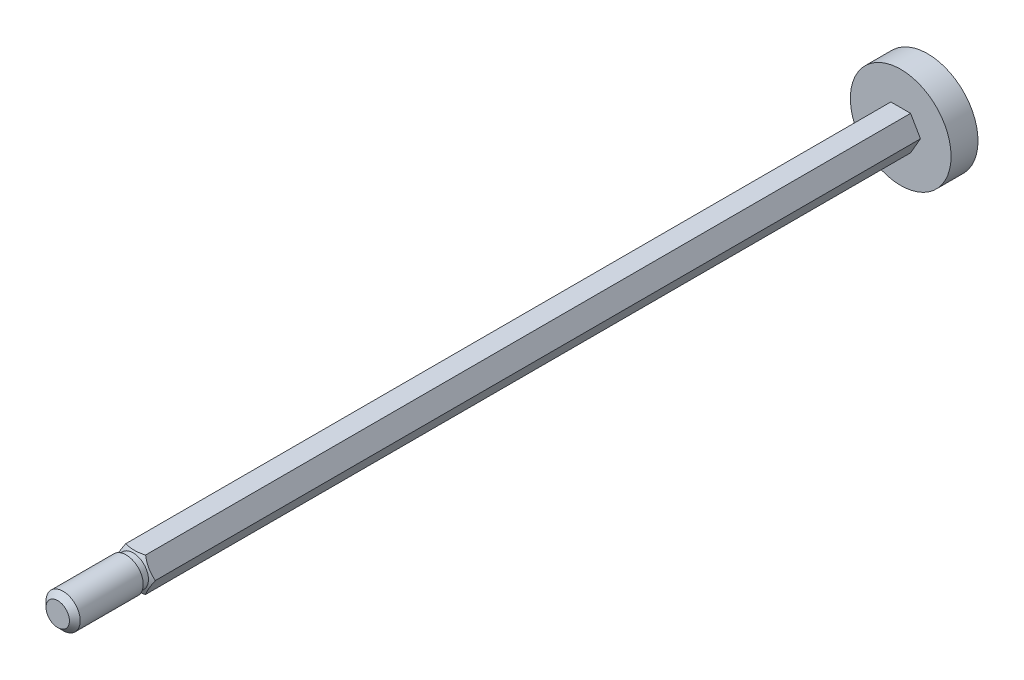
ISO-10303-21;
HEADER;
FILE_DESCRIPTION(('STEP AP214'),'2;1');
FILE_NAME('part.step','',(''),(''),'','','');
FILE_SCHEMA(('AUTOMOTIVE_DESIGN { 1 0 10303 214 1 1 1 1 }'));
ENDSEC;
DATA;
#1=APPLICATION_CONTEXT('core data for automotive mechanical design processes');
#2=APPLICATION_PROTOCOL_DEFINITION('international standard','automotive_design',2000,#1);
#3=PRODUCT_CONTEXT('',#1,'mechanical');
#4=PRODUCT('Part','Part','',(#3));
#5=PRODUCT_RELATED_PRODUCT_CATEGORY('part','',(#4));
#6=PRODUCT_DEFINITION_FORMATION('','',#4);
#7=PRODUCT_DEFINITION_CONTEXT('part definition',#1,'design');
#8=PRODUCT_DEFINITION('design','',#6,#7);
#9=PRODUCT_DEFINITION_SHAPE('','',#8);
#10=(LENGTH_UNIT() NAMED_UNIT(*) SI_UNIT(.MILLI.,.METRE.));
#11=(NAMED_UNIT(*) PLANE_ANGLE_UNIT() SI_UNIT($,.RADIAN.));
#12=(NAMED_UNIT(*) SI_UNIT($,.STERADIAN.) SOLID_ANGLE_UNIT());
#13=UNCERTAINTY_MEASURE_WITH_UNIT(LENGTH_MEASURE(1.E-05),#10,'distance_accuracy_value','');
#14=(GEOMETRIC_REPRESENTATION_CONTEXT(3) GLOBAL_UNCERTAINTY_ASSIGNED_CONTEXT((#13)) GLOBAL_UNIT_ASSIGNED_CONTEXT((#10,
#11,#12)) REPRESENTATION_CONTEXT('',''));
#15=CARTESIAN_POINT('',(0.,0.,0.));
#16=DIRECTION('',(0.,0.,1.));
#17=DIRECTION('',(1.,0.,0.));
#18=AXIS2_PLACEMENT_3D('',#15,#16,#17);
#19=CARTESIAN_POINT('',(0.,0.,47.2885337532627));
#20=DIRECTION('',(0.,0.,-1.));
#21=DIRECTION('',(-1.,0.,0.));
#22=AXIS2_PLACEMENT_3D('',#19,#20,#21);
#23=CYLINDRICAL_SURFACE('',#22,2.85);
#24=CARTESIAN_POINT('',(0.,0.,145.0119));
#25=DIRECTION('',(0.,0.,-1.));
#26=DIRECTION('',(-1.,0.,0.));
#27=AXIS2_PLACEMENT_3D('',#24,#25,#26);
#28=CIRCLE('',#27,2.85);
#29=CARTESIAN_POINT('',(-2.85,0.,145.0119));
#30=VERTEX_POINT('',#29);
#31=EDGE_CURVE('E92',#30,#30,#28,.T.);
#32=ORIENTED_EDGE('',*,*,#31,.F.);
#33=EDGE_LOOP('',(#32));
#34=FACE_BOUND('',#33,.T.);
#35=CARTESIAN_POINT('',(0.,0.,146.3119));
#36=DIRECTION('',(0.,0.,-1.));
#37=DIRECTION('',(-1.,0.,0.));
#38=AXIS2_PLACEMENT_3D('',#35,#36,#37);
#39=CIRCLE('',#38,2.85);
#40=CARTESIAN_POINT('',(-2.85,0.,146.3119));
#41=VERTEX_POINT('',#40);
#42=EDGE_CURVE('E178',#41,#41,#39,.T.);
#43=ORIENTED_EDGE('',*,*,#42,.T.);
#44=EDGE_LOOP('',(#43));
#45=FACE_BOUND('',#44,.T.);
#46=ADVANCED_FACE('F34',(#34,#45),#23,.T.);
#47=CARTESIAN_POINT('',(0.,-5.39,146.3119));
#48=DIRECTION('',(0.,0.,1.));
#49=DIRECTION('',(1.,0.,0.));
#50=AXIS2_PLACEMENT_3D('',#47,#48,#49);
#51=PLANE('',#50);
#52=CARTESIAN_POINT('',(0.,0.,146.3119));
#53=DIRECTION('',(0.,0.,1.));
#54=DIRECTION('',(1.,0.,0.));
#55=AXIS2_PLACEMENT_3D('',#52,#53,#54);
#56=CIRCLE('',#55,3.175);
#57=CARTESIAN_POINT('',(3.175,0.,146.3119));
#58=VERTEX_POINT('',#57);
#59=EDGE_CURVE('E38',#58,#58,#56,.F.);
#60=ORIENTED_EDGE('',*,*,#59,.T.);
#61=EDGE_LOOP('',(#60));
#62=FACE_BOUND('',#61,.T.);
#63=ORIENTED_EDGE('',*,*,#42,.F.);
#64=EDGE_LOOP('',(#63));
#65=FACE_BOUND('',#64,.T.);
#66=ADVANCED_FACE('F146',(#62,#65),#51,.F.);
#67=CARTESIAN_POINT('',(0.,0.,159.0119));
#68=DIRECTION('',(0.,0.,-1.));
#69=DIRECTION('',(-1.,0.,0.));
#70=AXIS2_PLACEMENT_3D('',#67,#68,#69);
#71=PLANE('',#70);
#72=CARTESIAN_POINT('',(0.,0.,159.0119));
#73=DIRECTION('',(0.,0.,-1.));
#74=DIRECTION('',(-1.,0.,0.));
#75=AXIS2_PLACEMENT_3D('',#72,#73,#74);
#76=CIRCLE('',#75,2.17499999999998);
#77=CARTESIAN_POINT('',(-2.17499999999998,0.,159.0119));
#78=VERTEX_POINT('',#77);
#79=EDGE_CURVE('E12',#78,#78,#76,.F.);
#80=ORIENTED_EDGE('',*,*,#79,.T.);
#81=EDGE_LOOP('',(#80));
#82=FACE_BOUND('',#81,.T.);
#83=ADVANCED_FACE('F138',(#82),#71,.F.);
#84=CARTESIAN_POINT('',(0.,0.,158.0119));
#85=DIRECTION('',(0.,0.,-1.));
#86=DIRECTION('',(-1.,0.,0.));
#87=AXIS2_PLACEMENT_3D('',#84,#85,#86);
#88=CONICAL_SURFACE('',#87,3.175,0.785398163397457);
#89=ORIENTED_EDGE('',*,*,#79,.F.);
#90=EDGE_LOOP('',(#89));
#91=FACE_BOUND('',#90,.T.);
#92=CARTESIAN_POINT('',(0.,0.,158.0119));
#93=DIRECTION('',(0.,0.,-1.));
#94=DIRECTION('',(-1.,0.,0.));
#95=AXIS2_PLACEMENT_3D('',#92,#93,#94);
#96=CIRCLE('',#95,3.175);
#97=CARTESIAN_POINT('',(-3.175,0.,158.0119));
#98=VERTEX_POINT('',#97);
#99=EDGE_CURVE('E43',#98,#98,#96,.T.);
#100=ORIENTED_EDGE('',*,*,#99,.F.);
#101=EDGE_LOOP('',(#100));
#102=FACE_BOUND('',#101,.T.);
#103=ADVANCED_FACE('F36',(#91,#102),#88,.T.);
#104=CARTESIAN_POINT('',(0.,0.,145.0119));
#105=DIRECTION('',(0.,0.,1.));
#106=DIRECTION('',(1.,0.,0.));
#107=AXIS2_PLACEMENT_3D('',#104,#105,#106);
#108=CYLINDRICAL_SURFACE('',#107,3.175);
#109=ORIENTED_EDGE('',*,*,#59,.F.);
#110=EDGE_LOOP('',(#109));
#111=FACE_BOUND('',#110,.T.);
#112=ORIENTED_EDGE('',*,*,#99,.T.);
#113=EDGE_LOOP('',(#112));
#114=FACE_BOUND('',#113,.T.);
#115=ADVANCED_FACE('F135',(#111,#114),#108,.T.);
#116=CARTESIAN_POINT('',(0.,0.,145.0119));
#117=DIRECTION('',(0.,0.,-1.));
#118=DIRECTION('',(-1.,0.,0.));
#119=AXIS2_PLACEMENT_3D('',#116,#117,#118);
#120=CONICAL_SURFACE('',#119,2.85,1.0471975511966);
#121=ORIENTED_EDGE('',*,*,#31,.T.);
#122=EDGE_LOOP('',(#121));
#123=FACE_BOUND('',#122,.T.);
#124=CARTESIAN_POINT('',(3.66628967940797,0.000200000000000435,144.540614930708));
#125=CARTESIAN_POINT('',(3.58573465404144,-0.139325396739819,144.58714122849));
#126=CARTESIAN_POINT('',(3.5044842831422,-0.28005516727113,144.629455297605));
#127=CARTESIAN_POINT('',(3.34057658667739,-0.563951625299745,144.703315153805));
#128=CARTESIAN_POINT('',(3.25791634856063,-0.707123357483721,144.734834811604));
#129=CARTESIAN_POINT('',(3.09362029773873,-0.991692464990171,144.78390005753));
#130=CARTESIAN_POINT('',(3.01200976494065,-1.1330460542292,144.80177219561));
#131=CARTESIAN_POINT('',(2.84840466612415,-1.41641839775671,144.823108348481));
#132=CARTESIAN_POINT('',(2.76641069482226,-1.55843612196594,144.826590030881));
#133=CARTESIAN_POINT('',(2.61319853595151,-1.82380736546738,144.819349461791));
#134=CARTESIAN_POINT('',(2.54195742074887,-1.94720059658622,144.81040501637));
#135=CARTESIAN_POINT('',(2.39993932886093,-2.19318314733013,144.782055586145));
#136=CARTESIAN_POINT('',(2.32916284344061,-2.31577161605927,144.762640915803));
#137=CARTESIAN_POINT('',(2.18685190354837,-2.56226139442551,144.714105431702));
#138=CARTESIAN_POINT('',(2.11533546210696,-2.68613150457856,144.684778864041));
#139=CARTESIAN_POINT('',(1.97336927110383,-2.93202416035301,144.618218968851));
#140=CARTESIAN_POINT('',(1.90291770254254,-3.05404985657409,144.581001282063));
#141=CARTESIAN_POINT('',(1.83297163462323,-3.1752,144.540614930708));
#142=B_SPLINE_CURVE_WITH_KNOTS('',3,(#124,#125,#126,#127,#128,#129,#130,#131,#132,#133,#134,
#135,#136,#137,#138,#139,#140,#141),.UNSPECIFIED.,.F.,.F.,(4,2,2,2,2,2,2,2,4),(0.,
0.503278731073376,1.00776724301493,1.49976968502822,1.99116790059652,2.4190487940215,
2.84732618162395,3.28510386250598,3.72202181665389),.UNSPECIFIED.);
#143=CARTESIAN_POINT('',(3.66617420935412,0.,144.540681600524));
#144=VERTEX_POINT('',#143);
#145=CARTESIAN_POINT('',(1.83308710467707,-3.175,144.540681600524));
#146=VERTEX_POINT('',#145);
#147=EDGE_CURVE('E86',#144,#146,#142,.T.);
#148=ORIENTED_EDGE('',*,*,#147,.F.);
#149=CARTESIAN_POINT('',(1.83297163462322,3.1752,144.540614930708));
#150=CARTESIAN_POINT('',(1.91352665998974,3.03567460326018,144.58714122849));
#151=CARTESIAN_POINT('',(1.99477703088899,2.89494483272887,144.629455297605));
#152=CARTESIAN_POINT('',(2.15868472735379,2.61104837470026,144.703315153805));
#153=CARTESIAN_POINT('',(2.24134496547056,2.46787664251628,144.734834811604));
#154=CARTESIAN_POINT('',(2.40564101629246,2.18330753500983,144.78390005753));
#155=CARTESIAN_POINT('',(2.48725154909054,2.0419539457708,144.80177219561));
#156=CARTESIAN_POINT('',(2.65085664790704,1.75858160224328,144.823108348481));
#157=CARTESIAN_POINT('',(2.73285061920893,1.61656387803406,144.826590030881));
#158=CARTESIAN_POINT('',(2.88606277807968,1.35119263453261,144.819349461791));
#159=CARTESIAN_POINT('',(2.95730389328232,1.22779940341378,144.81040501637));
#160=CARTESIAN_POINT('',(3.09932198517026,0.981816852669869,144.782055586145));
#161=CARTESIAN_POINT('',(3.17009847059058,0.859228383940723,144.762640915803));
#162=CARTESIAN_POINT('',(3.31240941048282,0.612738605574486,144.714105431702));
#163=CARTESIAN_POINT('',(3.38392585192423,0.488868495421432,144.684778864041));
#164=CARTESIAN_POINT('',(3.52589204292736,0.242975839646988,144.618218968851));
#165=CARTESIAN_POINT('',(3.59634361148865,0.120950143425907,144.581001282063));
#166=CARTESIAN_POINT('',(3.66628967940797,-0.000200000000005549,144.540614930708));
#167=B_SPLINE_CURVE_WITH_KNOTS('',3,(#149,#150,#151,#152,#153,#154,#155,#156,#157,#158,#159,
#160,#161,#162,#163,#164,#165,#166),.UNSPECIFIED.,.F.,.F.,(4,2,2,2,2,2,2,2,4),(0.,
0.503278731073379,1.00776724301493,1.49976968502823,1.99116790059653,2.41904879402151,
2.84732618162396,3.28510386250599,3.7220218166539),.UNSPECIFIED.);
#168=CARTESIAN_POINT('',(1.83308710467706,3.175,144.540681600524));
#169=VERTEX_POINT('',#168);
#170=EDGE_CURVE('E89',#169,#144,#167,.T.);
#171=ORIENTED_EDGE('',*,*,#170,.F.);
#172=CARTESIAN_POINT('',(-4.96708287666465,3.175,143.253794374387));
#173=CARTESIAN_POINT('',(-4.82801275366401,3.175,143.32142838011));
#174=CARTESIAN_POINT('',(-4.68862792743909,3.175,143.388426149287));
#175=CARTESIAN_POINT('',(-4.40906161794101,3.175,143.520792130007));
#176=CARTESIAN_POINT('',(-4.26888001698864,3.175,143.586160092729));
#177=CARTESIAN_POINT('',(-3.98685151676126,3.175,143.715228889386));
#178=CARTESIAN_POINT('',(-3.84499973155098,3.175,143.77891908317));
#179=CARTESIAN_POINT('',(-3.56018259747773,3.175,143.903749239693));
#180=CARTESIAN_POINT('',(-3.41721730041745,3.175,143.964889320237));
#181=CARTESIAN_POINT('',(-3.12522795949079,3.175,144.085902492478));
#182=CARTESIAN_POINT('',(-2.97615911426206,3.175,144.145668063008));
#183=CARTESIAN_POINT('',(-2.67629359264177,3.175,144.260779577851));
#184=CARTESIAN_POINT('',(-2.52549672694188,3.175,144.316125032534));
#185=CARTESIAN_POINT('',(-2.22220352724404,3.175,144.420975420622));
#186=CARTESIAN_POINT('',(-2.06971118866149,3.175,144.470491797313));
#187=CARTESIAN_POINT('',(-1.76253967353647,3.175,144.562123986505));
#188=CARTESIAN_POINT('',(-1.60786118799103,3.175,144.604242083327));
#189=CARTESIAN_POINT('',(-1.29706604150476,3.175,144.678866619975));
#190=CARTESIAN_POINT('',(-1.14096206535349,3.175,144.711424928532));
#191=CARTESIAN_POINT('',(-0.826768850241255,3.175,144.765109505029));
#192=CARTESIAN_POINT('',(-0.668679823735353,3.175,144.78623698589));
#193=CARTESIAN_POINT('',(-0.353388925868498,3.175,144.815099914652));
#194=CARTESIAN_POINT('',(-0.196203535939884,3.175,144.823010956444));
#195=CARTESIAN_POINT('',(0.118279729197718,3.175,144.825235336419));
#196=CARTESIAN_POINT('',(0.27557760700527,3.175,144.819548349618));
#197=CARTESIAN_POINT('',(0.541304571487749,3.175,144.798861518026));
#198=CARTESIAN_POINT('',(0.650012775051853,3.175,144.787229288021));
#199=CARTESIAN_POINT('',(0.866657164111718,3.175,144.758170773273));
#200=CARTESIAN_POINT('',(0.974593248087706,3.175,144.740743740419));
#201=CARTESIAN_POINT('',(1.29708163011009,3.175,144.680684065917));
#202=CARTESIAN_POINT('',(1.51020447853066,3.175,144.630282533305));
#203=CARTESIAN_POINT('',(1.8290433550999,3.175,144.542558392224));
#204=CARTESIAN_POINT('',(1.93640172571691,3.175,144.510862644683));
#205=CARTESIAN_POINT('',(2.15007576775773,3.175,144.444101546823));
#206=CARTESIAN_POINT('',(2.25639143114177,3.175,144.409036170545));
#207=CARTESIAN_POINT('',(2.46801400783489,3.175,144.336105071953));
#208=CARTESIAN_POINT('',(2.57332120846991,3.175,144.298240175802));
#209=CARTESIAN_POINT('',(2.78305624679618,3.175,144.220163364962));
#210=CARTESIAN_POINT('',(2.88748410511143,3.175,144.179951505495));
#211=CARTESIAN_POINT('',(3.17161288157018,3.175,144.067462724283));
#212=CARTESIAN_POINT('',(3.35053983671718,3.175,143.993232646709));
#213=CARTESIAN_POINT('',(3.70654087434477,3.175,143.840439404124));
#214=CARTESIAN_POINT('',(3.88361474472631,3.175,143.76187574942));
#215=CARTESIAN_POINT('',(4.23633675346545,3.175,143.601459250658));
#216=CARTESIAN_POINT('',(4.41198436632634,3.175,143.519605254997));
#217=CARTESIAN_POINT('',(4.76209555991007,3.175,143.353397855725));
#218=CARTESIAN_POINT('',(4.93655910420077,3.175,143.269044375633));
#219=CARTESIAN_POINT('',(5.28480544033994,3.175,143.098259527104));
#220=CARTESIAN_POINT('',(5.45858672554285,3.175,143.011825092767));
#221=CARTESIAN_POINT('',(5.80537304795155,3.175,142.837411201741));
#222=CARTESIAN_POINT('',(5.97837807704885,3.175,142.749431728961));
#223=CARTESIAN_POINT('',(6.49636979305033,3.175,142.483693137628));
#224=CARTESIAN_POINT('',(6.84041237135029,3.175,142.30409459548));
#225=CARTESIAN_POINT('',(7.48990061276769,3.175,141.961106359875));
#226=CARTESIAN_POINT('',(7.79552214118922,3.175,141.798048092451));
#227=CARTESIAN_POINT('',(8.40576274296164,3.175,141.470021613395));
#228=CARTESIAN_POINT('',(8.71038175209307,3.175,141.305053282352));
#229=CARTESIAN_POINT('',(9.31783520063475,3.175,140.974259154386));
#230=CARTESIAN_POINT('',(9.62067220295262,3.175,140.808438056595));
#231=CARTESIAN_POINT('',(10.2257214735073,3.175,140.475716207909));
#232=CARTESIAN_POINT('',(10.5279337894058,3.175,140.30881554372));
#233=CARTESIAN_POINT('',(10.829927451968,3.175,140.141522568302));
#234=B_SPLINE_CURVE_WITH_KNOTS('',3,(#172,#173,#174,#175,#176,#177,#178,#179,#180,#181,#182,
#183,#184,#185,#186,#187,#188,#189,#190,#191,#192,#193,#194,#195,#196,#197,#198,#199,#200,#201,
#202,#203,#204,#205,#206,#207,#208,#209,#210,#211,#212,#213,#214,#215,#216,#217,#218,#219,#220,
#221,#222,#223,#224,#225,#226,#227,#228,#229,#230,#231,#232,#233),.UNSPECIFIED.,.F.,.F.,(4,2,2,
2,2,2,2,2,2,2,2,2,2,2,2,2,2,2,2,2,2,2,2,2,2,2,2,2,2,2,4),(0.,0.463938351874231,
0.927947104093039,1.39440884468903,1.86084901269398,2.34260493697772,2.82441415303467,
3.30526115464907,3.78595942614429,4.26399921144653,4.74198826219184,5.21357470815357,
5.68517242481287,6.01300068779486,6.3408712899672,6.99694101132937,7.33272968353595,
7.6685209428055,8.00421349970168,8.33989816124804,8.92095267428452,9.50207298142803,
10.08339847961,10.6647417839994,11.2470014986314,11.8292672812463,12.9935335284848,
14.0327247818938,15.0719813563652,16.1077695322516,17.1434755257342),.UNSPECIFIED.);
#235=CARTESIAN_POINT('',(-1.83308710467731,3.175,144.540681600524));
#236=VERTEX_POINT('',#235);
#237=EDGE_CURVE('E100',#236,#169,#234,.T.);
#238=ORIENTED_EDGE('',*,*,#237,.F.);
#239=CARTESIAN_POINT('',(-3.66628967940796,-0.000200000000002561,144.540614930708));
#240=CARTESIAN_POINT('',(-3.58573465404144,0.139325396739816,144.58714122849));
#241=CARTESIAN_POINT('',(-3.50448428314219,0.280055167271128,144.629455297605));
#242=CARTESIAN_POINT('',(-3.34057658667739,0.563951625299744,144.703315153805));
#243=CARTESIAN_POINT('',(-3.25791634856063,0.70712335748372,144.734834811604));
#244=CARTESIAN_POINT('',(-3.09362029773873,0.99169246499017,144.78390005753));
#245=CARTESIAN_POINT('',(-3.01200976494065,1.1330460542292,144.80177219561));
#246=CARTESIAN_POINT('',(-2.84840466612415,1.41641839775671,144.823108348481));
#247=CARTESIAN_POINT('',(-2.76641069482226,1.55843612196593,144.826590030881));
#248=CARTESIAN_POINT('',(-2.61319853595151,1.82380736546738,144.819349461791));
#249=CARTESIAN_POINT('',(-2.54195742074887,1.94720059658622,144.81040501637));
#250=CARTESIAN_POINT('',(-2.39993932886093,2.19318314733013,144.782055586145));
#251=CARTESIAN_POINT('',(-2.32916284344061,2.31577161605927,144.762640915803));
#252=CARTESIAN_POINT('',(-2.18685190354837,2.56226139442551,144.714105431702));
#253=CARTESIAN_POINT('',(-2.11533546210696,2.68613150457857,144.684778864041));
#254=CARTESIAN_POINT('',(-1.97336927110383,2.93202416035301,144.618218968851));
#255=CARTESIAN_POINT('',(-1.90291770254253,3.05404985657409,144.581001282063));
#256=CARTESIAN_POINT('',(-1.83297163462322,3.1752,144.540614930708));
#257=B_SPLINE_CURVE_WITH_KNOTS('',3,(#239,#240,#241,#242,#243,#244,#245,#246,#247,#248,#249,
#250,#251,#252,#253,#254,#255,#256),.UNSPECIFIED.,.F.,.F.,(4,2,2,2,2,2,2,2,4),(0.,
0.503278731073377,1.00776724301493,1.49976968502822,1.99116790059652,2.4190487940215,
2.84732618162395,3.28510386250598,3.7220218166539),.UNSPECIFIED.);
#258=CARTESIAN_POINT('',(-3.66617420935412,0.,144.540681600524));
#259=VERTEX_POINT('',#258);
#260=EDGE_CURVE('E198',#259,#236,#257,.T.);
#261=ORIENTED_EDGE('',*,*,#260,.F.);
#262=CARTESIAN_POINT('',(-1.83297163462323,-3.1752,144.540614930708));
#263=CARTESIAN_POINT('',(-1.91352665998975,-3.03567460326018,144.58714122849));
#264=CARTESIAN_POINT('',(-1.994777030889,-2.89494483272887,144.629455297605));
#265=CARTESIAN_POINT('',(-2.1586847273538,-2.61104837470025,144.703315153805));
#266=CARTESIAN_POINT('',(-2.24134496547056,-2.46787664251628,144.734834811604));
#267=CARTESIAN_POINT('',(-2.40564101629246,-2.18330753500983,144.78390005753));
#268=CARTESIAN_POINT('',(-2.48725154909053,-2.0419539457708,144.80177219561));
#269=CARTESIAN_POINT('',(-2.65085664790703,-1.75858160224329,144.823108348481));
#270=CARTESIAN_POINT('',(-2.73285061920893,-1.61656387803407,144.826590030881));
#271=CARTESIAN_POINT('',(-2.88606277807967,-1.35119263453263,144.819349461791));
#272=CARTESIAN_POINT('',(-2.95730389328231,-1.22779940341379,144.81040501637));
#273=CARTESIAN_POINT('',(-3.09932198517026,-0.981816852669878,144.782055586145));
#274=CARTESIAN_POINT('',(-3.17009847059058,-0.859228383940731,144.762640915803));
#275=CARTESIAN_POINT('',(-3.31240941048282,-0.612738605574492,144.714105431702));
#276=CARTESIAN_POINT('',(-3.38392585192423,-0.488868495421438,144.684778864041));
#277=CARTESIAN_POINT('',(-3.52589204292736,-0.242975839646992,144.618218968851));
#278=CARTESIAN_POINT('',(-3.59634361148865,-0.12095014342591,144.581001282063));
#279=CARTESIAN_POINT('',(-3.66628967940796,0.000200000000003183,144.540614930708));
#280=B_SPLINE_CURVE_WITH_KNOTS('',3,(#262,#263,#264,#265,#266,#267,#268,#269,#270,#271,#272,
#273,#274,#275,#276,#277,#278,#279),.UNSPECIFIED.,.F.,.F.,(4,2,2,2,2,2,2,2,4),(0.,
0.503278731073366,1.00776724301491,1.4997696850282,1.9911679005965,2.41904879402148,
2.84732618162394,3.28510386250596,3.72202181665388),.UNSPECIFIED.);
#281=CARTESIAN_POINT('',(-1.83308710467706,-3.175,144.540681600524));
#282=VERTEX_POINT('',#281);
#283=EDGE_CURVE('E179',#282,#259,#280,.T.);
#284=ORIENTED_EDGE('',*,*,#283,.F.);
#285=CARTESIAN_POINT('',(-4.96708287666465,-3.175,143.253794374387));
#286=CARTESIAN_POINT('',(-4.82801275366402,-3.175,143.32142838011));
#287=CARTESIAN_POINT('',(-4.68862792743909,-3.175,143.388426149287));
#288=CARTESIAN_POINT('',(-4.40906161794101,-3.175,143.520792130007));
#289=CARTESIAN_POINT('',(-4.26888001698864,-3.175,143.586160092729));
#290=CARTESIAN_POINT('',(-3.98685151676126,-3.175,143.715228889386));
#291=CARTESIAN_POINT('',(-3.84499973155099,-3.175,143.77891908317));
#292=CARTESIAN_POINT('',(-3.56018259747774,-3.175,143.903749239693));
#293=CARTESIAN_POINT('',(-3.41721730041746,-3.175,143.964889320237));
#294=CARTESIAN_POINT('',(-3.1252279594908,-3.175,144.085902492478));
#295=CARTESIAN_POINT('',(-2.97615911426206,-3.175,144.145668063008));
#296=CARTESIAN_POINT('',(-2.67629359264177,-3.175,144.260779577851));
#297=CARTESIAN_POINT('',(-2.52549672694188,-3.175,144.316125032534));
#298=CARTESIAN_POINT('',(-2.22220352724404,-3.175,144.420975420622));
#299=CARTESIAN_POINT('',(-2.06971118866149,-3.175,144.470491797313));
#300=CARTESIAN_POINT('',(-1.76253967353647,-3.175,144.562123986505));
#301=CARTESIAN_POINT('',(-1.60786118799103,-3.175,144.604242083327));
#302=CARTESIAN_POINT('',(-1.29706604150477,-3.175,144.678866619975));
#303=CARTESIAN_POINT('',(-1.14096206535349,-3.175,144.711424928532));
#304=CARTESIAN_POINT('',(-0.826768850241257,-3.175,144.765109505029));
#305=CARTESIAN_POINT('',(-0.668679823735355,-3.175,144.78623698589));
#306=CARTESIAN_POINT('',(-0.3533889258685,-3.175,144.815099914652));
#307=CARTESIAN_POINT('',(-0.196203535939886,-3.175,144.823010956444));
#308=CARTESIAN_POINT('',(0.118279729197716,-3.175,144.825235336419));
#309=CARTESIAN_POINT('',(0.275577607005269,-3.175,144.819548349618));
#310=CARTESIAN_POINT('',(0.541304571487747,-3.175,144.798861518026));
#311=CARTESIAN_POINT('',(0.650012775051851,-3.175,144.787229288021));
#312=CARTESIAN_POINT('',(0.866657164111716,-3.175,144.758170773273));
#313=CARTESIAN_POINT('',(0.974593248087704,-3.175,144.740743740419));
#314=CARTESIAN_POINT('',(1.29708163011009,-3.175,144.680684065917));
#315=CARTESIAN_POINT('',(1.51020447853066,-3.175,144.630282533305));
#316=CARTESIAN_POINT('',(1.8290433550999,-3.175,144.542558392224));
#317=CARTESIAN_POINT('',(1.93640172571691,-3.175,144.510862644683));
#318=CARTESIAN_POINT('',(2.15007576775774,-3.175,144.444101546823));
#319=CARTESIAN_POINT('',(2.25639143114177,-3.175,144.409036170545));
#320=CARTESIAN_POINT('',(2.4680140078349,-3.175,144.336105071953));
#321=CARTESIAN_POINT('',(2.57332120846992,-3.175,144.298240175802));
#322=CARTESIAN_POINT('',(2.78305624679619,-3.175,144.220163364962));
#323=CARTESIAN_POINT('',(2.88748410511143,-3.175,144.179951505495));
#324=CARTESIAN_POINT('',(3.17161288157018,-3.175,144.067462724283));
#325=CARTESIAN_POINT('',(3.35053983671718,-3.175,143.993232646709));
#326=CARTESIAN_POINT('',(3.70654087434477,-3.175,143.840439404124));
#327=CARTESIAN_POINT('',(3.88361474472631,-3.175,143.76187574942));
#328=CARTESIAN_POINT('',(4.23633675346544,-3.175,143.601459250658));
#329=CARTESIAN_POINT('',(4.41198436632634,-3.175,143.519605254997));
#330=CARTESIAN_POINT('',(4.76209555991007,-3.175,143.353397855725));
#331=CARTESIAN_POINT('',(4.93655910420077,-3.175,143.269044375633));
#332=CARTESIAN_POINT('',(5.28480544033994,-3.175,143.098259527104));
#333=CARTESIAN_POINT('',(5.45858672554284,-3.175,143.011825092767));
#334=CARTESIAN_POINT('',(5.80537304795155,-3.175,142.837411201741));
#335=CARTESIAN_POINT('',(5.97837807704885,-3.175,142.749431728961));
#336=CARTESIAN_POINT('',(6.49636979305033,-3.175,142.483693137628));
#337=CARTESIAN_POINT('',(6.84041237135029,-3.175,142.30409459548));
#338=CARTESIAN_POINT('',(7.48990061276769,-3.175,141.961106359875));
#339=CARTESIAN_POINT('',(7.79552214118922,-3.175,141.798048092451));
#340=CARTESIAN_POINT('',(8.40576274296164,-3.175,141.470021613395));
#341=CARTESIAN_POINT('',(8.71038175209308,-3.175,141.305053282352));
#342=CARTESIAN_POINT('',(9.31783520063475,-3.175,140.974259154386));
#343=CARTESIAN_POINT('',(9.62067220295262,-3.175,140.808438056595));
#344=CARTESIAN_POINT('',(10.2257214735073,-3.175,140.475716207909));
#345=CARTESIAN_POINT('',(10.5279337894058,-3.175,140.30881554372));
#346=CARTESIAN_POINT('',(10.829927451968,-3.175,140.141522568302));
#347=B_SPLINE_CURVE_WITH_KNOTS('',3,(#285,#286,#287,#288,#289,#290,#291,#292,#293,#294,#295,
#296,#297,#298,#299,#300,#301,#302,#303,#304,#305,#306,#307,#308,#309,#310,#311,#312,#313,#314,
#315,#316,#317,#318,#319,#320,#321,#322,#323,#324,#325,#326,#327,#328,#329,#330,#331,#332,#333,
#334,#335,#336,#337,#338,#339,#340,#341,#342,#343,#344,#345,#346),.UNSPECIFIED.,.F.,.F.,(4,2,2,
2,2,2,2,2,2,2,2,2,2,2,2,2,2,2,2,2,2,2,2,2,2,2,2,2,2,2,4),(0.,0.46393835187423,0.927947104093039,
1.39440884468902,1.86084901269398,2.34260493697772,2.82441415303467,3.30526115464907,
3.78595942614429,4.26399921144653,4.74198826219184,5.21357470815356,5.68517242481287,
6.01300068779485,6.3408712899672,6.99694101132937,7.33272968353595,7.6685209428055,
8.00421349970169,8.33989816124803,8.92095267428451,9.50207298142803,10.08339847961,
10.6647417839994,11.2470014986314,11.8292672812463,12.9935335284848,14.0327247818938,
15.0719813563652,16.1077695322516,17.1434755257342),.UNSPECIFIED.);
#348=EDGE_CURVE('E50',#146,#282,#347,.F.);
#349=ORIENTED_EDGE('',*,*,#348,.F.);
#350=EDGE_LOOP('',(#148,#171,#238,#261,#284,#349));
#351=FACE_BOUND('',#350,.T.);
#352=ADVANCED_FACE('F88',(#123,#351),#120,.T.);
#353=CARTESIAN_POINT('',(0.,0.,-2.5));
#354=DIRECTION('',(0.,0.,1.));
#355=DIRECTION('',(1.,0.,0.));
#356=AXIS2_PLACEMENT_3D('',#353,#354,#355);
#357=PLANE('',#356);
#358=CARTESIAN_POINT('',(0.,0.,-2.5));
#359=DIRECTION('',(0.,0.,1.));
#360=DIRECTION('',(1.,0.,0.));
#361=AXIS2_PLACEMENT_3D('',#358,#359,#360);
#362=CIRCLE('',#361,9.35);
#363=CARTESIAN_POINT('',(9.35,0.,-2.5));
#364=VERTEX_POINT('',#363);
#365=EDGE_CURVE('E106',#364,#364,#362,.T.);
#366=ORIENTED_EDGE('',*,*,#365,.F.);
#367=EDGE_LOOP('',(#366));
#368=FACE_BOUND('',#367,.T.);
#369=ADVANCED_FACE('F239',(#368),#357,.F.);
#370=CARTESIAN_POINT('',(0.,0.,2.5));
#371=DIRECTION('',(0.,0.,-1.));
#372=DIRECTION('',(-1.,0.,0.));
#373=AXIS2_PLACEMENT_3D('',#370,#371,#372);
#374=CYLINDRICAL_SURFACE('',#373,9.35);
#375=CARTESIAN_POINT('',(0.,0.,2.5));
#376=DIRECTION('',(0.,0.,1.));
#377=DIRECTION('',(1.,0.,0.));
#378=AXIS2_PLACEMENT_3D('',#375,#376,#377);
#379=CIRCLE('',#378,9.35);
#380=CARTESIAN_POINT('',(9.35,0.,2.5));
#381=VERTEX_POINT('',#380);
#382=EDGE_CURVE('E109',#381,#381,#379,.T.);
#383=ORIENTED_EDGE('',*,*,#382,.F.);
#384=EDGE_LOOP('',(#383));
#385=FACE_BOUND('',#384,.T.);
#386=ORIENTED_EDGE('',*,*,#365,.T.);
#387=EDGE_LOOP('',(#386));
#388=FACE_BOUND('',#387,.T.);
#389=ADVANCED_FACE('F243',(#385,#388),#374,.T.);
#390=CARTESIAN_POINT('',(0.,0.,2.5));
#391=DIRECTION('',(0.,0.,1.));
#392=DIRECTION('',(1.,0.,0.));
#393=AXIS2_PLACEMENT_3D('',#390,#391,#392);
#394=PLANE('',#393);
#395=ORIENTED_EDGE('',*,*,#382,.T.);
#396=EDGE_LOOP('',(#395));
#397=FACE_BOUND('',#396,.T.);
#398=DIRECTION('',(-0.5,-0.866025403784439,0.));
#399=VECTOR('',#398,1.);
#400=CARTESIAN_POINT('',(2.7496306570156,-1.5875,2.5));
#401=LINE('',#400,#399);
#402=CARTESIAN_POINT('',(3.66617420935413,0.,2.50000000000006));
#403=VERTEX_POINT('',#402);
#404=CARTESIAN_POINT('',(1.83308710467707,-3.175,2.5));
#405=VERTEX_POINT('',#404);
#406=EDGE_CURVE('E104',#403,#405,#401,.T.);
#407=ORIENTED_EDGE('',*,*,#406,.T.);
#408=DIRECTION('',(-1.,0.,0.));
#409=VECTOR('',#408,1.);
#410=CARTESIAN_POINT('',(0.,-3.175,2.5));
#411=LINE('',#410,#409);
#412=CARTESIAN_POINT('',(-1.83308710467706,-3.175,2.50000000000006));
#413=VERTEX_POINT('',#412);
#414=EDGE_CURVE('E129',#405,#413,#411,.T.);
#415=ORIENTED_EDGE('',*,*,#414,.T.);
#416=DIRECTION('',(-0.5,0.866025403784438,0.));
#417=VECTOR('',#416,1.);
#418=CARTESIAN_POINT('',(-2.74963065701559,-1.5875,2.5));
#419=LINE('',#418,#417);
#420=CARTESIAN_POINT('',(-3.66617420935412,0.,2.50000000000006));
#421=VERTEX_POINT('',#420);
#422=EDGE_CURVE('E126',#413,#421,#419,.T.);
#423=ORIENTED_EDGE('',*,*,#422,.T.);
#424=DIRECTION('',(0.5,0.866025403784439,0.));
#425=VECTOR('',#424,1.);
#426=CARTESIAN_POINT('',(-2.74963065701559,1.5875,2.5));
#427=LINE('',#426,#425);
#428=CARTESIAN_POINT('',(-1.83308710467706,3.175,2.50000000000006));
#429=VERTEX_POINT('',#428);
#430=EDGE_CURVE('E123',#421,#429,#427,.T.);
#431=ORIENTED_EDGE('',*,*,#430,.T.);
#432=DIRECTION('',(1.,0.,0.));
#433=VECTOR('',#432,1.);
#434=CARTESIAN_POINT('',(0.,3.175,2.5));
#435=LINE('',#434,#433);
#436=CARTESIAN_POINT('',(1.83308710467706,3.175,2.50000000000006));
#437=VERTEX_POINT('',#436);
#438=EDGE_CURVE('E120',#429,#437,#435,.T.);
#439=ORIENTED_EDGE('',*,*,#438,.T.);
#440=DIRECTION('',(0.500000000000001,-0.866025403784438,0.));
#441=VECTOR('',#440,1.);
#442=CARTESIAN_POINT('',(2.74963065701559,1.5875,2.5));
#443=LINE('',#442,#441);
#444=EDGE_CURVE('E118',#437,#403,#443,.T.);
#445=ORIENTED_EDGE('',*,*,#444,.T.);
#446=EDGE_LOOP('',(#407,#415,#423,#431,#439,#445));
#447=FACE_BOUND('',#446,.T.);
#448=ADVANCED_FACE('F202',(#397,#447),#394,.T.);
#449=CARTESIAN_POINT('',(1.83308710467707,-3.175,168.71168522099));
#450=DIRECTION('',(-0.866025403784439,0.5,0.));
#451=DIRECTION('',(-0.5,-0.866025403784439,0.));
#452=AXIS2_PLACEMENT_3D('',#449,#450,#451);
#453=PLANE('',#452);
#454=DIRECTION('',(0.,0.,-1.));
#455=VECTOR('',#454,1.);
#456=CARTESIAN_POINT('',(3.66617420935413,0.,168.71168522099));
#457=LINE('',#456,#455);
#458=EDGE_CURVE('E98',#144,#403,#457,.T.);
#459=ORIENTED_EDGE('',*,*,#458,.F.);
#460=ORIENTED_EDGE('',*,*,#147,.T.);
#461=DIRECTION('',(0.,0.,-1.));
#462=VECTOR('',#461,1.);
#463=CARTESIAN_POINT('',(1.83308710467707,-3.175,168.71168522099));
#464=LINE('',#463,#462);
#465=EDGE_CURVE('E57',#146,#405,#464,.T.);
#466=ORIENTED_EDGE('',*,*,#465,.T.);
#467=ORIENTED_EDGE('',*,*,#406,.F.);
#468=EDGE_LOOP('',(#459,#460,#466,#467));
#469=FACE_BOUND('',#468,.T.);
#470=ADVANCED_FACE('F102',(#469),#453,.F.);
#471=CARTESIAN_POINT('',(3.66617420935413,0.,168.71168522099));
#472=DIRECTION('',(-0.866025403784438,-0.500000000000001,0.));
#473=DIRECTION('',(0.500000000000001,-0.866025403784438,0.));
#474=AXIS2_PLACEMENT_3D('',#471,#472,#473);
#475=PLANE('',#474);
#476=DIRECTION('',(0.,0.,-1.));
#477=VECTOR('',#476,1.);
#478=CARTESIAN_POINT('',(1.83308710467706,3.175,168.71168522099));
#479=LINE('',#478,#477);
#480=EDGE_CURVE('E99',#169,#437,#479,.T.);
#481=ORIENTED_EDGE('',*,*,#480,.F.);
#482=ORIENTED_EDGE('',*,*,#170,.T.);
#483=ORIENTED_EDGE('',*,*,#458,.T.);
#484=ORIENTED_EDGE('',*,*,#444,.F.);
#485=EDGE_LOOP('',(#481,#482,#483,#484));
#486=FACE_BOUND('',#485,.T.);
#487=ADVANCED_FACE('F96',(#486),#475,.F.);
#488=CARTESIAN_POINT('',(1.83308710467706,3.175,168.71168522099));
#489=DIRECTION('',(0.,-1.,0.));
#490=DIRECTION('',(1.,0.,0.));
#491=AXIS2_PLACEMENT_3D('',#488,#489,#490);
#492=PLANE('',#491);
#493=DIRECTION('',(0.,0.,-1.));
#494=VECTOR('',#493,1.);
#495=CARTESIAN_POINT('',(-1.83308710467706,3.175,168.71168522099));
#496=LINE('',#495,#494);
#497=EDGE_CURVE('E111',#236,#429,#496,.T.);
#498=ORIENTED_EDGE('',*,*,#497,.F.);
#499=ORIENTED_EDGE('',*,*,#237,.T.);
#500=ORIENTED_EDGE('',*,*,#480,.T.);
#501=ORIENTED_EDGE('',*,*,#438,.F.);
#502=EDGE_LOOP('',(#498,#499,#500,#501));
#503=FACE_BOUND('',#502,.T.);
#504=ADVANCED_FACE('F200',(#503),#492,.F.);
#505=CARTESIAN_POINT('',(-1.83308710467706,3.175,168.71168522099));
#506=DIRECTION('',(0.866025403784438,-0.5,0.));
#507=DIRECTION('',(0.5,0.866025403784439,0.));
#508=AXIS2_PLACEMENT_3D('',#505,#506,#507);
#509=PLANE('',#508);
#510=DIRECTION('',(0.,0.,-1.));
#511=VECTOR('',#510,1.);
#512=CARTESIAN_POINT('',(-3.66617420935412,0.,168.71168522099));
#513=LINE('',#512,#511);
#514=EDGE_CURVE('E190',#259,#421,#513,.T.);
#515=ORIENTED_EDGE('',*,*,#514,.F.);
#516=ORIENTED_EDGE('',*,*,#260,.T.);
#517=ORIENTED_EDGE('',*,*,#497,.T.);
#518=ORIENTED_EDGE('',*,*,#430,.F.);
#519=EDGE_LOOP('',(#515,#516,#517,#518));
#520=FACE_BOUND('',#519,.T.);
#521=ADVANCED_FACE('F197',(#520),#509,.F.);
#522=CARTESIAN_POINT('',(-3.66617420935412,0.,168.71168522099));
#523=DIRECTION('',(0.866025403784438,0.5,0.));
#524=DIRECTION('',(-0.5,0.866025403784438,0.));
#525=AXIS2_PLACEMENT_3D('',#522,#523,#524);
#526=PLANE('',#525);
#527=DIRECTION('',(0.,0.,-1.));
#528=VECTOR('',#527,1.);
#529=CARTESIAN_POINT('',(-1.83308710467706,-3.175,168.71168522099));
#530=LINE('',#529,#528);
#531=EDGE_CURVE('E188',#282,#413,#530,.T.);
#532=ORIENTED_EDGE('',*,*,#531,.F.);
#533=ORIENTED_EDGE('',*,*,#283,.T.);
#534=ORIENTED_EDGE('',*,*,#514,.T.);
#535=ORIENTED_EDGE('',*,*,#422,.F.);
#536=EDGE_LOOP('',(#532,#533,#534,#535));
#537=FACE_BOUND('',#536,.T.);
#538=ADVANCED_FACE('F167',(#537),#526,.F.);
#539=CARTESIAN_POINT('',(-1.83308710467706,-3.175,168.71168522099));
#540=DIRECTION('',(0.,1.,0.));
#541=DIRECTION('',(0.,0.,1.));
#542=AXIS2_PLACEMENT_3D('',#539,#540,#541);
#543=PLANE('',#542);
#544=ORIENTED_EDGE('',*,*,#465,.F.);
#545=ORIENTED_EDGE('',*,*,#348,.T.);
#546=ORIENTED_EDGE('',*,*,#531,.T.);
#547=ORIENTED_EDGE('',*,*,#414,.F.);
#548=EDGE_LOOP('',(#544,#545,#546,#547));
#549=FACE_BOUND('',#548,.T.);
#550=ADVANCED_FACE('F163',(#549),#543,.F.);
#551=CLOSED_SHELL('',(#46,#66,#83,#103,#115,#352,#369,#389,#448,#470,#487,#504,#521,#538,#550));
#552=MANIFOLD_SOLID_BREP('B2',#551);
#553=ADVANCED_BREP_SHAPE_REPRESENTATION('',(#18,#552),#14);
#554=SHAPE_DEFINITION_REPRESENTATION(#9,#553);
ENDSEC;
END-ISO-10303-21;
